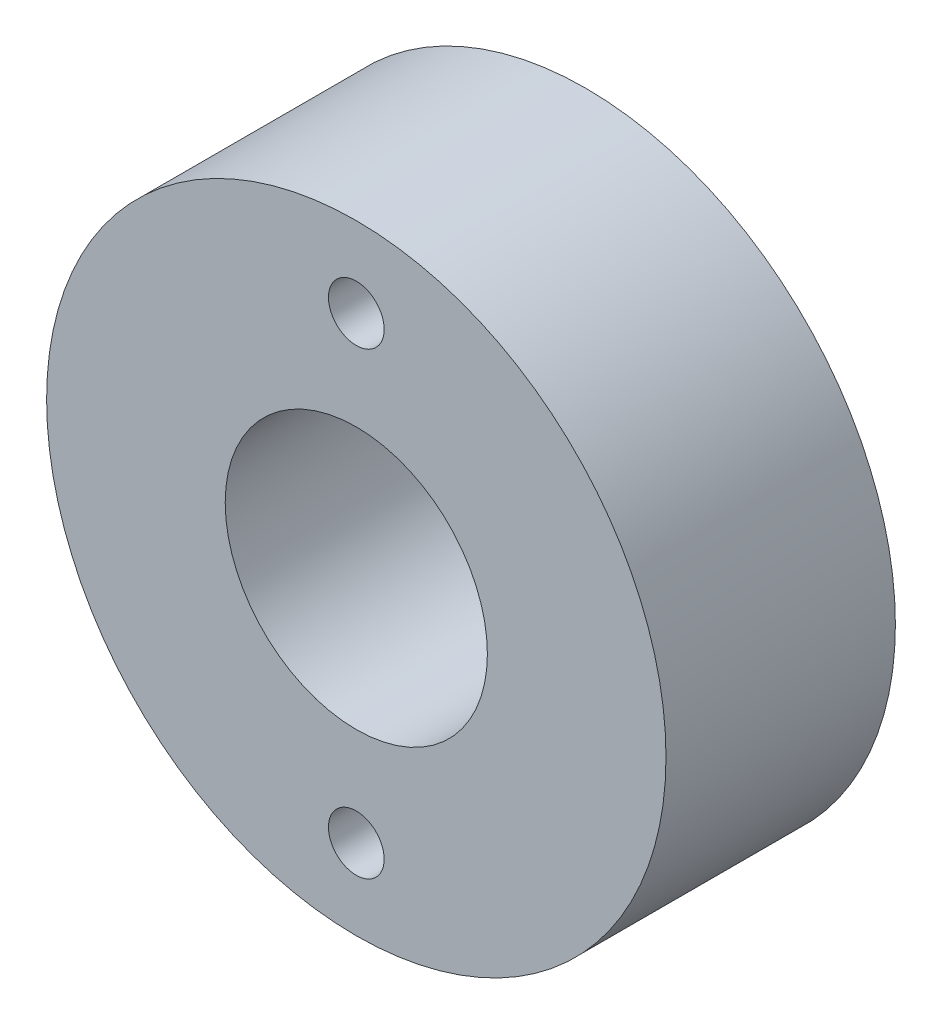
ISO-10303-21;
HEADER;
FILE_DESCRIPTION(('STEP AP214'),'2;1');
FILE_NAME('part.step','',(''),(''),'','','');
FILE_SCHEMA(('AUTOMOTIVE_DESIGN { 1 0 10303 214 1 1 1 1 }'));
ENDSEC;
DATA;
#1=APPLICATION_CONTEXT('core data for automotive mechanical design processes');
#2=APPLICATION_PROTOCOL_DEFINITION('international standard','automotive_design',2000,#1);
#3=PRODUCT_CONTEXT('',#1,'mechanical');
#4=PRODUCT('Part','Part','',(#3));
#5=PRODUCT_RELATED_PRODUCT_CATEGORY('part','',(#4));
#6=PRODUCT_DEFINITION_FORMATION('','',#4);
#7=PRODUCT_DEFINITION_CONTEXT('part definition',#1,'design');
#8=PRODUCT_DEFINITION('design','',#6,#7);
#9=PRODUCT_DEFINITION_SHAPE('','',#8);
#10=(LENGTH_UNIT() NAMED_UNIT(*) SI_UNIT(.MILLI.,.METRE.));
#11=(NAMED_UNIT(*) PLANE_ANGLE_UNIT() SI_UNIT($,.RADIAN.));
#12=(NAMED_UNIT(*) SI_UNIT($,.STERADIAN.) SOLID_ANGLE_UNIT());
#13=UNCERTAINTY_MEASURE_WITH_UNIT(LENGTH_MEASURE(1.E-05),#10,'distance_accuracy_value','');
#14=(GEOMETRIC_REPRESENTATION_CONTEXT(3) GLOBAL_UNCERTAINTY_ASSIGNED_CONTEXT((#13)) GLOBAL_UNIT_ASSIGNED_CONTEXT((#10,
#11,#12)) REPRESENTATION_CONTEXT('',''));
#15=CARTESIAN_POINT('',(0.,0.,0.));
#16=DIRECTION('',(0.,0.,1.));
#17=DIRECTION('',(1.,0.,0.));
#18=AXIS2_PLACEMENT_3D('',#15,#16,#17);
#19=CARTESIAN_POINT('',(0.,0.,7.));
#20=DIRECTION('',(0.,0.,-1.));
#21=DIRECTION('',(-1.,0.,0.));
#22=AXIS2_PLACEMENT_3D('',#19,#20,#21);
#23=CYLINDRICAL_SURFACE('',#22,9.45);
#24=CARTESIAN_POINT('',(0.,0.,7.));
#25=DIRECTION('',(0.,0.,1.));
#26=DIRECTION('',(1.,0.,0.));
#27=AXIS2_PLACEMENT_3D('',#24,#25,#26);
#28=CIRCLE('',#27,9.45);
#29=CARTESIAN_POINT('',(9.45,0.,7.));
#30=VERTEX_POINT('',#29);
#31=EDGE_CURVE('E10',#30,#30,#28,.T.);
#32=ORIENTED_EDGE('',*,*,#31,.F.);
#33=EDGE_LOOP('',(#32));
#34=FACE_BOUND('',#33,.T.);
#35=CARTESIAN_POINT('',(0.,0.,0.));
#36=DIRECTION('',(0.,0.,1.));
#37=DIRECTION('',(1.,0.,0.));
#38=AXIS2_PLACEMENT_3D('',#35,#36,#37);
#39=CIRCLE('',#38,9.45);
#40=CARTESIAN_POINT('',(9.45,0.,0.));
#41=VERTEX_POINT('',#40);
#42=EDGE_CURVE('E44',#41,#41,#39,.T.);
#43=ORIENTED_EDGE('',*,*,#42,.T.);
#44=EDGE_LOOP('',(#43));
#45=FACE_BOUND('',#44,.T.);
#46=ADVANCED_FACE('F41',(#34,#45),#23,.T.);
#47=CARTESIAN_POINT('',(0.,0.,7.));
#48=DIRECTION('',(0.,0.,1.));
#49=DIRECTION('',(1.,0.,0.));
#50=AXIS2_PLACEMENT_3D('',#47,#48,#49);
#51=PLANE('',#50);
#52=CARTESIAN_POINT('',(0.,7.,7.));
#53=DIRECTION('',(0.,0.,1.));
#54=DIRECTION('',(1.,0.,0.));
#55=AXIS2_PLACEMENT_3D('',#52,#53,#54);
#56=CIRCLE('',#55,0.849999999999998);
#57=CARTESIAN_POINT('',(0.849999999999998,7.,7.));
#58=VERTEX_POINT('',#57);
#59=EDGE_CURVE('E74',#58,#58,#56,.T.);
#60=ORIENTED_EDGE('',*,*,#59,.F.);
#61=EDGE_LOOP('',(#60));
#62=FACE_BOUND('',#61,.T.);
#63=CARTESIAN_POINT('',(0.,-7.,7.));
#64=DIRECTION('',(0.,0.,1.));
#65=DIRECTION('',(1.,0.,0.));
#66=AXIS2_PLACEMENT_3D('',#63,#64,#65);
#67=CIRCLE('',#66,0.849999999999998);
#68=CARTESIAN_POINT('',(0.849999999999998,-7.,7.));
#69=VERTEX_POINT('',#68);
#70=EDGE_CURVE('E66',#69,#69,#67,.T.);
#71=ORIENTED_EDGE('',*,*,#70,.F.);
#72=EDGE_LOOP('',(#71));
#73=FACE_BOUND('',#72,.T.);
#74=CARTESIAN_POINT('',(0.,0.,7.));
#75=DIRECTION('',(0.,0.,1.));
#76=DIRECTION('',(1.,0.,0.));
#77=AXIS2_PLACEMENT_3D('',#74,#75,#76);
#78=CIRCLE('',#77,4.);
#79=CARTESIAN_POINT('',(4.,0.,7.));
#80=VERTEX_POINT('',#79);
#81=EDGE_CURVE('E58',#80,#80,#78,.T.);
#82=ORIENTED_EDGE('',*,*,#81,.F.);
#83=EDGE_LOOP('',(#82));
#84=FACE_BOUND('',#83,.T.);
#85=ORIENTED_EDGE('',*,*,#31,.T.);
#86=EDGE_LOOP('',(#85));
#87=FACE_BOUND('',#86,.T.);
#88=ADVANCED_FACE('F81',(#62,#73,#84,#87),#51,.T.);
#89=CARTESIAN_POINT('',(0.,0.,0.));
#90=DIRECTION('',(0.,0.,1.));
#91=DIRECTION('',(1.,0.,0.));
#92=AXIS2_PLACEMENT_3D('',#89,#90,#91);
#93=PLANE('',#92);
#94=CARTESIAN_POINT('',(0.,7.,0.));
#95=DIRECTION('',(0.,0.,1.));
#96=DIRECTION('',(1.,0.,0.));
#97=AXIS2_PLACEMENT_3D('',#94,#95,#96);
#98=CIRCLE('',#97,0.849999999999998);
#99=CARTESIAN_POINT('',(0.849999999999998,7.,0.));
#100=VERTEX_POINT('',#99);
#101=EDGE_CURVE('E70',#100,#100,#98,.T.);
#102=ORIENTED_EDGE('',*,*,#101,.T.);
#103=EDGE_LOOP('',(#102));
#104=FACE_BOUND('',#103,.T.);
#105=CARTESIAN_POINT('',(0.,-7.,0.));
#106=DIRECTION('',(0.,0.,1.));
#107=DIRECTION('',(1.,0.,0.));
#108=AXIS2_PLACEMENT_3D('',#105,#106,#107);
#109=CIRCLE('',#108,0.849999999999998);
#110=CARTESIAN_POINT('',(0.849999999999998,-7.,0.));
#111=VERTEX_POINT('',#110);
#112=EDGE_CURVE('E62',#111,#111,#109,.T.);
#113=ORIENTED_EDGE('',*,*,#112,.T.);
#114=EDGE_LOOP('',(#113));
#115=FACE_BOUND('',#114,.T.);
#116=CARTESIAN_POINT('',(0.,0.,0.));
#117=DIRECTION('',(0.,0.,1.));
#118=DIRECTION('',(1.,0.,0.));
#119=AXIS2_PLACEMENT_3D('',#116,#117,#118);
#120=CIRCLE('',#119,4.);
#121=CARTESIAN_POINT('',(4.,0.,0.));
#122=VERTEX_POINT('',#121);
#123=EDGE_CURVE('E53',#122,#122,#120,.F.);
#124=ORIENTED_EDGE('',*,*,#123,.F.);
#125=EDGE_LOOP('',(#124));
#126=FACE_BOUND('',#125,.T.);
#127=ORIENTED_EDGE('',*,*,#42,.F.);
#128=EDGE_LOOP('',(#127));
#129=FACE_BOUND('',#128,.T.);
#130=ADVANCED_FACE('F84',(#104,#115,#126,#129),#93,.F.);
#131=CARTESIAN_POINT('',(0.,0.,-0.00100000000000013));
#132=DIRECTION('',(0.,0.,1.));
#133=DIRECTION('',(1.,0.,0.));
#134=AXIS2_PLACEMENT_3D('',#131,#132,#133);
#135=CYLINDRICAL_SURFACE('',#134,4.);
#136=ORIENTED_EDGE('',*,*,#81,.T.);
#137=EDGE_LOOP('',(#136));
#138=FACE_BOUND('',#137,.T.);
#139=ORIENTED_EDGE('',*,*,#123,.T.);
#140=EDGE_LOOP('',(#139));
#141=FACE_BOUND('',#140,.T.);
#142=ADVANCED_FACE('F90',(#138,#141),#135,.F.);
#143=CARTESIAN_POINT('',(0.,-7.,7.));
#144=DIRECTION('',(0.,0.,1.));
#145=DIRECTION('',(1.,0.,0.));
#146=AXIS2_PLACEMENT_3D('',#143,#144,#145);
#147=CYLINDRICAL_SURFACE('',#146,0.849999999999998);
#148=ORIENTED_EDGE('',*,*,#112,.F.);
#149=EDGE_LOOP('',(#148));
#150=FACE_BOUND('',#149,.T.);
#151=ORIENTED_EDGE('',*,*,#70,.T.);
#152=EDGE_LOOP('',(#151));
#153=FACE_BOUND('',#152,.T.);
#154=ADVANCED_FACE('F93',(#150,#153),#147,.F.);
#155=CARTESIAN_POINT('',(0.,7.,7.));
#156=DIRECTION('',(0.,0.,1.));
#157=DIRECTION('',(1.,0.,0.));
#158=AXIS2_PLACEMENT_3D('',#155,#156,#157);
#159=CYLINDRICAL_SURFACE('',#158,0.849999999999998);
#160=ORIENTED_EDGE('',*,*,#101,.F.);
#161=EDGE_LOOP('',(#160));
#162=FACE_BOUND('',#161,.T.);
#163=ORIENTED_EDGE('',*,*,#59,.T.);
#164=EDGE_LOOP('',(#163));
#165=FACE_BOUND('',#164,.T.);
#166=ADVANCED_FACE('F79',(#162,#165),#159,.F.);
#167=CLOSED_SHELL('',(#46,#88,#130,#142,#154,#166));
#168=MANIFOLD_SOLID_BREP('B2',#167);
#169=ADVANCED_BREP_SHAPE_REPRESENTATION('',(#18,#168),#14);
#170=SHAPE_DEFINITION_REPRESENTATION(#9,#169);
ENDSEC;
END-ISO-10303-21;
